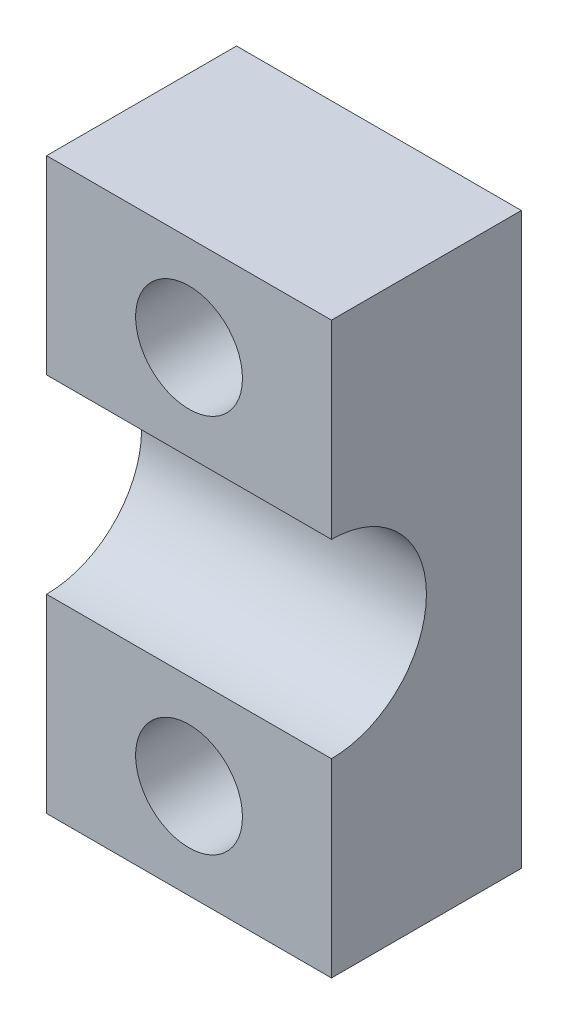
ISO-10303-21;
HEADER;
FILE_DESCRIPTION(('STEP AP214'),'2;1');
FILE_NAME('part.step','',(''),(''),'','','');
FILE_SCHEMA(('AUTOMOTIVE_DESIGN { 1 0 10303 214 1 1 1 1 }'));
ENDSEC;
DATA;
#1=APPLICATION_CONTEXT('core data for automotive mechanical design processes');
#2=APPLICATION_PROTOCOL_DEFINITION('international standard','automotive_design',2000,#1);
#3=PRODUCT_CONTEXT('',#1,'mechanical');
#4=PRODUCT('Part','Part','',(#3));
#5=PRODUCT_RELATED_PRODUCT_CATEGORY('part','',(#4));
#6=PRODUCT_DEFINITION_FORMATION('','',#4);
#7=PRODUCT_DEFINITION_CONTEXT('part definition',#1,'design');
#8=PRODUCT_DEFINITION('design','',#6,#7);
#9=PRODUCT_DEFINITION_SHAPE('','',#8);
#10=(LENGTH_UNIT() NAMED_UNIT(*) SI_UNIT(.MILLI.,.METRE.));
#11=(NAMED_UNIT(*) PLANE_ANGLE_UNIT() SI_UNIT($,.RADIAN.));
#12=(NAMED_UNIT(*) SI_UNIT($,.STERADIAN.) SOLID_ANGLE_UNIT());
#13=UNCERTAINTY_MEASURE_WITH_UNIT(LENGTH_MEASURE(1.E-05),#10,'distance_accuracy_value','');
#14=(GEOMETRIC_REPRESENTATION_CONTEXT(3) GLOBAL_UNCERTAINTY_ASSIGNED_CONTEXT((#13)) GLOBAL_UNIT_ASSIGNED_CONTEXT((#10,
#11,#12)) REPRESENTATION_CONTEXT('',''));
#15=CARTESIAN_POINT('',(0.,0.,0.));
#16=DIRECTION('',(0.,0.,1.));
#17=DIRECTION('',(1.,0.,0.));
#18=AXIS2_PLACEMENT_3D('',#15,#16,#17);
#19=CARTESIAN_POINT('',(6.,0.,0.));
#20=DIRECTION('',(-1.,0.,0.));
#21=DIRECTION('',(0.,0.,1.));
#22=AXIS2_PLACEMENT_3D('',#19,#20,#21);
#23=CYLINDRICAL_SURFACE('',#22,4.);
#24=CARTESIAN_POINT('',(-6.,0.,0.));
#25=DIRECTION('',(-1.,0.,0.));
#26=DIRECTION('',(0.,0.,-1.));
#27=AXIS2_PLACEMENT_3D('',#24,#25,#26);
#28=CIRCLE('',#27,4.);
#29=CARTESIAN_POINT('',(-6.,4.,0.));
#30=VERTEX_POINT('',#29);
#31=CARTESIAN_POINT('',(-6.,-4.,0.));
#32=VERTEX_POINT('',#31);
#33=EDGE_CURVE('E116',#30,#32,#28,.T.);
#34=ORIENTED_EDGE('',*,*,#33,.T.);
#35=DIRECTION('',(-1.,0.,0.));
#36=VECTOR('',#35,1.);
#37=CARTESIAN_POINT('',(6.,-4.,0.));
#38=LINE('',#37,#36);
#39=CARTESIAN_POINT('',(6.,-4.,0.));
#40=VERTEX_POINT('',#39);
#41=EDGE_CURVE('E11',#40,#32,#38,.T.);
#42=ORIENTED_EDGE('',*,*,#41,.F.);
#43=CARTESIAN_POINT('',(6.,0.,0.));
#44=DIRECTION('',(-1.,0.,0.));
#45=DIRECTION('',(0.,0.,-1.));
#46=AXIS2_PLACEMENT_3D('',#43,#44,#45);
#47=CIRCLE('',#46,4.);
#48=CARTESIAN_POINT('',(6.,4.,0.));
#49=VERTEX_POINT('',#48);
#50=EDGE_CURVE('E127',#49,#40,#47,.T.);
#51=ORIENTED_EDGE('',*,*,#50,.F.);
#52=DIRECTION('',(-1.,0.,0.));
#53=VECTOR('',#52,1.);
#54=CARTESIAN_POINT('',(6.,4.,0.));
#55=LINE('',#54,#53);
#56=EDGE_CURVE('E112',#49,#30,#55,.T.);
#57=ORIENTED_EDGE('',*,*,#56,.T.);
#58=EDGE_LOOP('',(#34,#42,#51,#57));
#59=FACE_BOUND('',#58,.T.);
#60=ADVANCED_FACE('F32',(#59),#23,.F.);
#61=CARTESIAN_POINT('',(6.,-12.,0.));
#62=DIRECTION('',(0.,0.,-1.));
#63=DIRECTION('',(0.,1.,0.));
#64=AXIS2_PLACEMENT_3D('',#61,#62,#63);
#65=PLANE('',#64);
#66=CARTESIAN_POINT('',(0.,-8.,0.));
#67=DIRECTION('',(0.,0.,1.));
#68=DIRECTION('',(1.,0.,0.));
#69=AXIS2_PLACEMENT_3D('',#66,#67,#68);
#70=CIRCLE('',#69,2.25);
#71=CARTESIAN_POINT('',(2.25,-8.,0.));
#72=VERTEX_POINT('',#71);
#73=EDGE_CURVE('E180',#72,#72,#70,.T.);
#74=ORIENTED_EDGE('',*,*,#73,.F.);
#75=EDGE_LOOP('',(#74));
#76=FACE_BOUND('',#75,.T.);
#77=DIRECTION('',(0.,-1.,0.));
#78=VECTOR('',#77,1.);
#79=CARTESIAN_POINT('',(-6.,-12.,0.));
#80=LINE('',#79,#78);
#81=CARTESIAN_POINT('',(-6.,-12.,0.));
#82=VERTEX_POINT('',#81);
#83=EDGE_CURVE('E119',#32,#82,#80,.T.);
#84=ORIENTED_EDGE('',*,*,#83,.T.);
#85=DIRECTION('',(-1.,0.,0.));
#86=VECTOR('',#85,1.);
#87=CARTESIAN_POINT('',(6.,-12.,0.));
#88=LINE('',#87,#86);
#89=CARTESIAN_POINT('',(6.,-12.,0.));
#90=VERTEX_POINT('',#89);
#91=EDGE_CURVE('E40',#90,#82,#88,.T.);
#92=ORIENTED_EDGE('',*,*,#91,.F.);
#93=DIRECTION('',(0.,-1.,0.));
#94=VECTOR('',#93,1.);
#95=CARTESIAN_POINT('',(6.,-12.,0.));
#96=LINE('',#95,#94);
#97=EDGE_CURVE('E85',#40,#90,#96,.T.);
#98=ORIENTED_EDGE('',*,*,#97,.F.);
#99=ORIENTED_EDGE('',*,*,#41,.T.);
#100=EDGE_LOOP('',(#84,#92,#98,#99));
#101=FACE_BOUND('',#100,.T.);
#102=ADVANCED_FACE('F153',(#76,#101),#65,.F.);
#103=CARTESIAN_POINT('',(6.,-12.,-8.));
#104=DIRECTION('',(0.,1.,0.));
#105=DIRECTION('',(0.,0.,1.));
#106=AXIS2_PLACEMENT_3D('',#103,#104,#105);
#107=PLANE('',#106);
#108=DIRECTION('',(0.,0.,-1.));
#109=VECTOR('',#108,1.);
#110=CARTESIAN_POINT('',(-6.,-12.,-8.));
#111=LINE('',#110,#109);
#112=CARTESIAN_POINT('',(-6.,-12.,-8.));
#113=VERTEX_POINT('',#112);
#114=EDGE_CURVE('E122',#82,#113,#111,.T.);
#115=ORIENTED_EDGE('',*,*,#114,.T.);
#116=DIRECTION('',(-1.,0.,0.));
#117=VECTOR('',#116,1.);
#118=CARTESIAN_POINT('',(6.,-12.,-8.));
#119=LINE('',#118,#117);
#120=CARTESIAN_POINT('',(6.,-12.,-8.));
#121=VERTEX_POINT('',#120);
#122=EDGE_CURVE('E107',#121,#113,#119,.T.);
#123=ORIENTED_EDGE('',*,*,#122,.F.);
#124=DIRECTION('',(0.,0.,-1.));
#125=VECTOR('',#124,1.);
#126=CARTESIAN_POINT('',(6.,-12.,-8.));
#127=LINE('',#126,#125);
#128=EDGE_CURVE('E98',#90,#121,#127,.T.);
#129=ORIENTED_EDGE('',*,*,#128,.F.);
#130=ORIENTED_EDGE('',*,*,#91,.T.);
#131=EDGE_LOOP('',(#115,#123,#129,#130));
#132=FACE_BOUND('',#131,.T.);
#133=ADVANCED_FACE('F133',(#132),#107,.F.);
#134=CARTESIAN_POINT('',(6.,12.,-8.));
#135=DIRECTION('',(0.,0.,1.));
#136=DIRECTION('',(1.,0.,0.));
#137=AXIS2_PLACEMENT_3D('',#134,#135,#136);
#138=PLANE('',#137);
#139=CARTESIAN_POINT('',(0.,-8.,-8.));
#140=DIRECTION('',(0.,0.,1.));
#141=DIRECTION('',(1.,0.,0.));
#142=AXIS2_PLACEMENT_3D('',#139,#140,#141);
#143=CIRCLE('',#142,2.25);
#144=CARTESIAN_POINT('',(2.25,-8.,-8.));
#145=VERTEX_POINT('',#144);
#146=EDGE_CURVE('E171',#145,#145,#143,.T.);
#147=ORIENTED_EDGE('',*,*,#146,.T.);
#148=EDGE_LOOP('',(#147));
#149=FACE_BOUND('',#148,.T.);
#150=CARTESIAN_POINT('',(0.,8.,-8.));
#151=DIRECTION('',(0.,0.,1.));
#152=DIRECTION('',(1.,0.,0.));
#153=AXIS2_PLACEMENT_3D('',#150,#151,#152);
#154=CIRCLE('',#153,2.25);
#155=CARTESIAN_POINT('',(2.25,8.,-8.));
#156=VERTEX_POINT('',#155);
#157=EDGE_CURVE('E120',#156,#156,#154,.T.);
#158=ORIENTED_EDGE('',*,*,#157,.T.);
#159=EDGE_LOOP('',(#158));
#160=FACE_BOUND('',#159,.T.);
#161=DIRECTION('',(0.,1.,0.));
#162=VECTOR('',#161,1.);
#163=CARTESIAN_POINT('',(-6.,12.,-8.));
#164=LINE('',#163,#162);
#165=CARTESIAN_POINT('',(-6.,12.,-8.));
#166=VERTEX_POINT('',#165);
#167=EDGE_CURVE('E106',#113,#166,#164,.T.);
#168=ORIENTED_EDGE('',*,*,#167,.T.);
#169=DIRECTION('',(-1.,0.,0.));
#170=VECTOR('',#169,1.);
#171=CARTESIAN_POINT('',(6.,12.,-8.));
#172=LINE('',#171,#170);
#173=CARTESIAN_POINT('',(6.,12.,-8.));
#174=VERTEX_POINT('',#173);
#175=EDGE_CURVE('E103',#174,#166,#172,.T.);
#176=ORIENTED_EDGE('',*,*,#175,.F.);
#177=DIRECTION('',(0.,1.,0.));
#178=VECTOR('',#177,1.);
#179=CARTESIAN_POINT('',(6.,12.,-8.));
#180=LINE('',#179,#178);
#181=EDGE_CURVE('E92',#121,#174,#180,.T.);
#182=ORIENTED_EDGE('',*,*,#181,.F.);
#183=ORIENTED_EDGE('',*,*,#122,.T.);
#184=EDGE_LOOP('',(#168,#176,#182,#183));
#185=FACE_BOUND('',#184,.T.);
#186=ADVANCED_FACE('F104',(#149,#160,#185),#138,.F.);
#187=CARTESIAN_POINT('',(6.,12.,0.));
#188=DIRECTION('',(0.,-1.,0.));
#189=DIRECTION('',(0.,0.,-1.));
#190=AXIS2_PLACEMENT_3D('',#187,#188,#189);
#191=PLANE('',#190);
#192=DIRECTION('',(0.,0.,1.));
#193=VECTOR('',#192,1.);
#194=CARTESIAN_POINT('',(-6.,12.,0.));
#195=LINE('',#194,#193);
#196=CARTESIAN_POINT('',(-6.,12.,0.));
#197=VERTEX_POINT('',#196);
#198=EDGE_CURVE('E71',#166,#197,#195,.T.);
#199=ORIENTED_EDGE('',*,*,#198,.T.);
#200=DIRECTION('',(-1.,0.,0.));
#201=VECTOR('',#200,1.);
#202=CARTESIAN_POINT('',(6.,12.,0.));
#203=LINE('',#202,#201);
#204=CARTESIAN_POINT('',(6.,12.,0.));
#205=VERTEX_POINT('',#204);
#206=EDGE_CURVE('E108',#205,#197,#203,.T.);
#207=ORIENTED_EDGE('',*,*,#206,.F.);
#208=DIRECTION('',(0.,0.,1.));
#209=VECTOR('',#208,1.);
#210=CARTESIAN_POINT('',(6.,12.,0.));
#211=LINE('',#210,#209);
#212=EDGE_CURVE('E96',#174,#205,#211,.T.);
#213=ORIENTED_EDGE('',*,*,#212,.F.);
#214=ORIENTED_EDGE('',*,*,#175,.T.);
#215=EDGE_LOOP('',(#199,#207,#213,#214));
#216=FACE_BOUND('',#215,.T.);
#217=ADVANCED_FACE('F110',(#216),#191,.F.);
#218=CARTESIAN_POINT('',(6.,4.,0.));
#219=DIRECTION('',(0.,0.,-1.));
#220=DIRECTION('',(0.,1.,0.));
#221=AXIS2_PLACEMENT_3D('',#218,#219,#220);
#222=PLANE('',#221);
#223=CARTESIAN_POINT('',(0.,8.,0.));
#224=DIRECTION('',(0.,0.,1.));
#225=DIRECTION('',(1.,0.,0.));
#226=AXIS2_PLACEMENT_3D('',#223,#224,#225);
#227=CIRCLE('',#226,2.25);
#228=CARTESIAN_POINT('',(2.25,8.,0.));
#229=VERTEX_POINT('',#228);
#230=EDGE_CURVE('E175',#229,#229,#227,.T.);
#231=ORIENTED_EDGE('',*,*,#230,.F.);
#232=EDGE_LOOP('',(#231));
#233=FACE_BOUND('',#232,.T.);
#234=DIRECTION('',(0.,-1.,0.));
#235=VECTOR('',#234,1.);
#236=CARTESIAN_POINT('',(-6.,4.,0.));
#237=LINE('',#236,#235);
#238=EDGE_CURVE('E77',#197,#30,#237,.T.);
#239=ORIENTED_EDGE('',*,*,#238,.T.);
#240=ORIENTED_EDGE('',*,*,#56,.F.);
#241=DIRECTION('',(0.,-1.,0.));
#242=VECTOR('',#241,1.);
#243=CARTESIAN_POINT('',(6.,4.,0.));
#244=LINE('',#243,#242);
#245=EDGE_CURVE('E48',#205,#49,#244,.T.);
#246=ORIENTED_EDGE('',*,*,#245,.F.);
#247=ORIENTED_EDGE('',*,*,#206,.T.);
#248=EDGE_LOOP('',(#239,#240,#246,#247));
#249=FACE_BOUND('',#248,.T.);
#250=ADVANCED_FACE('F140',(#233,#249),#222,.F.);
#251=CARTESIAN_POINT('',(6.,0.,0.));
#252=DIRECTION('',(1.,0.,0.));
#253=DIRECTION('',(0.,0.,-1.));
#254=AXIS2_PLACEMENT_3D('',#251,#252,#253);
#255=PLANE('',#254);
#256=ORIENTED_EDGE('',*,*,#50,.T.);
#257=ORIENTED_EDGE('',*,*,#97,.T.);
#258=ORIENTED_EDGE('',*,*,#128,.T.);
#259=ORIENTED_EDGE('',*,*,#181,.T.);
#260=ORIENTED_EDGE('',*,*,#212,.T.);
#261=ORIENTED_EDGE('',*,*,#245,.T.);
#262=EDGE_LOOP('',(#256,#257,#258,#259,#260,#261));
#263=FACE_BOUND('',#262,.T.);
#264=ADVANCED_FACE('F94',(#263),#255,.T.);
#265=CARTESIAN_POINT('',(-6.,0.,0.));
#266=DIRECTION('',(1.,0.,0.));
#267=DIRECTION('',(0.,0.,-1.));
#268=AXIS2_PLACEMENT_3D('',#265,#266,#267);
#269=PLANE('',#268);
#270=ORIENTED_EDGE('',*,*,#33,.F.);
#271=ORIENTED_EDGE('',*,*,#238,.F.);
#272=ORIENTED_EDGE('',*,*,#198,.F.);
#273=ORIENTED_EDGE('',*,*,#167,.F.);
#274=ORIENTED_EDGE('',*,*,#114,.F.);
#275=ORIENTED_EDGE('',*,*,#83,.F.);
#276=EDGE_LOOP('',(#270,#271,#272,#273,#274,#275));
#277=FACE_BOUND('',#276,.T.);
#278=ADVANCED_FACE('F136',(#277),#269,.F.);
#279=CARTESIAN_POINT('',(0.,8.,-8.));
#280=DIRECTION('',(0.,0.,1.));
#281=DIRECTION('',(1.,0.,0.));
#282=AXIS2_PLACEMENT_3D('',#279,#280,#281);
#283=CYLINDRICAL_SURFACE('',#282,2.25);
#284=ORIENTED_EDGE('',*,*,#157,.F.);
#285=EDGE_LOOP('',(#284));
#286=FACE_BOUND('',#285,.T.);
#287=ORIENTED_EDGE('',*,*,#230,.T.);
#288=EDGE_LOOP('',(#287));
#289=FACE_BOUND('',#288,.T.);
#290=ADVANCED_FACE('F188',(#286,#289),#283,.F.);
#291=CARTESIAN_POINT('',(0.,-8.,-8.));
#292=DIRECTION('',(0.,0.,1.));
#293=DIRECTION('',(1.,0.,0.));
#294=AXIS2_PLACEMENT_3D('',#291,#292,#293);
#295=CYLINDRICAL_SURFACE('',#294,2.25);
#296=ORIENTED_EDGE('',*,*,#146,.F.);
#297=EDGE_LOOP('',(#296));
#298=FACE_BOUND('',#297,.T.);
#299=ORIENTED_EDGE('',*,*,#73,.T.);
#300=EDGE_LOOP('',(#299));
#301=FACE_BOUND('',#300,.T.);
#302=ADVANCED_FACE('F186',(#298,#301),#295,.F.);
#303=CLOSED_SHELL('',(#60,#102,#133,#186,#217,#250,#264,#278,#290,#302));
#304=MANIFOLD_SOLID_BREP('B2',#303);
#305=ADVANCED_BREP_SHAPE_REPRESENTATION('',(#18,#304),#14);
#306=SHAPE_DEFINITION_REPRESENTATION(#9,#305);
ENDSEC;
END-ISO-10303-21;
